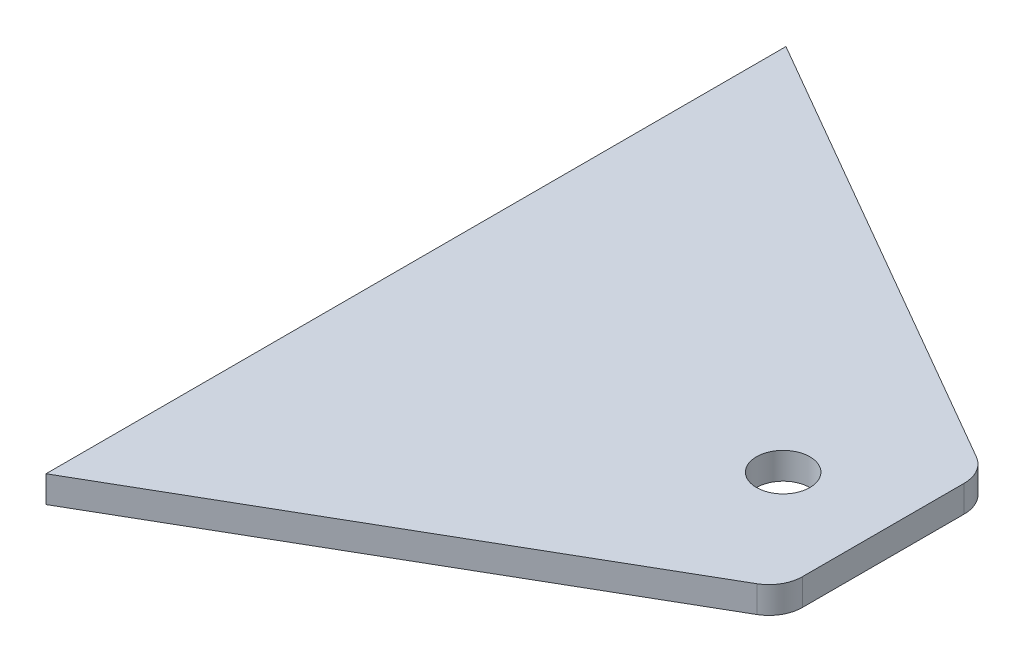
ISO-10303-21;
HEADER;
FILE_DESCRIPTION(('STEP AP214'),'2;1');
FILE_NAME('part.step','',(''),(''),'','','');
FILE_SCHEMA(('AUTOMOTIVE_DESIGN { 1 0 10303 214 1 1 1 1 }'));
ENDSEC;
DATA;
#1=APPLICATION_CONTEXT('core data for automotive mechanical design processes');
#2=APPLICATION_PROTOCOL_DEFINITION('international standard','automotive_design',2000,#1);
#3=PRODUCT_CONTEXT('',#1,'mechanical');
#4=PRODUCT('Part','Part','',(#3));
#5=PRODUCT_RELATED_PRODUCT_CATEGORY('part','',(#4));
#6=PRODUCT_DEFINITION_FORMATION('','',#4);
#7=PRODUCT_DEFINITION_CONTEXT('part definition',#1,'design');
#8=PRODUCT_DEFINITION('design','',#6,#7);
#9=PRODUCT_DEFINITION_SHAPE('','',#8);
#10=(LENGTH_UNIT() NAMED_UNIT(*) SI_UNIT(.MILLI.,.METRE.));
#11=(NAMED_UNIT(*) PLANE_ANGLE_UNIT() SI_UNIT($,.RADIAN.));
#12=(NAMED_UNIT(*) SI_UNIT($,.STERADIAN.) SOLID_ANGLE_UNIT());
#13=UNCERTAINTY_MEASURE_WITH_UNIT(LENGTH_MEASURE(1.E-05),#10,'distance_accuracy_value','');
#14=(GEOMETRIC_REPRESENTATION_CONTEXT(3) GLOBAL_UNCERTAINTY_ASSIGNED_CONTEXT((#13)) GLOBAL_UNIT_ASSIGNED_CONTEXT((#10,
#11,#12)) REPRESENTATION_CONTEXT('',''));
#15=CARTESIAN_POINT('',(0.,0.,0.));
#16=DIRECTION('',(0.,0.,1.));
#17=DIRECTION('',(1.,0.,0.));
#18=AXIS2_PLACEMENT_3D('',#15,#16,#17);
#19=CARTESIAN_POINT('',(69.9999999999992,4.,37.7259944682755));
#20=DIRECTION('',(-0.500000000000004,0.,-0.866025403784436));
#21=DIRECTION('',(-0.866025403784436,0.,0.500000000000004));
#22=AXIS2_PLACEMENT_3D('',#19,#20,#21);
#23=PLANE('',#22);
#24=DIRECTION('',(0.866025403784436,0.,-0.500000000000004));
#25=VECTOR('',#24,1.);
#26=CARTESIAN_POINT('',(69.9999999999992,0.,37.7259944682755));
#27=LINE('',#26,#25);
#28=CARTESIAN_POINT('',(-7.7889084071358E-13,0.,78.1405133115498));
#29=VERTEX_POINT('',#28);
#30=CARTESIAN_POINT('',(67.4999999999993,0.,39.1693701412496));
#31=VERTEX_POINT('',#30);
#32=EDGE_CURVE('E114',#29,#31,#27,.T.);
#33=ORIENTED_EDGE('',*,*,#32,.T.);
#34=DIRECTION('',(0.,-1.,0.));
#35=VECTOR('',#34,1.);
#36=CARTESIAN_POINT('',(67.4999999999993,4.,39.1693701412496));
#37=LINE('',#36,#35);
#38=CARTESIAN_POINT('',(67.4999999999993,4.,39.1693701412496));
#39=VERTEX_POINT('',#38);
#40=EDGE_CURVE('E58',#31,#39,#37,.F.);
#41=ORIENTED_EDGE('',*,*,#40,.T.);
#42=DIRECTION('',(0.866025403784436,0.,-0.500000000000004));
#43=VECTOR('',#42,1.);
#44=CARTESIAN_POINT('',(69.9999999999992,4.,37.7259944682755));
#45=LINE('',#44,#43);
#46=CARTESIAN_POINT('',(-7.7889084071358E-13,4.,78.1405133115498));
#47=VERTEX_POINT('',#46);
#48=EDGE_CURVE('E122',#47,#39,#45,.T.);
#49=ORIENTED_EDGE('',*,*,#48,.F.);
#50=DIRECTION('',(0.,-1.,0.));
#51=VECTOR('',#50,1.);
#52=CARTESIAN_POINT('',(-7.7889084071358E-13,4.,78.1405133115498));
#53=LINE('',#52,#51);
#54=EDGE_CURVE('E106',#47,#29,#53,.T.);
#55=ORIENTED_EDGE('',*,*,#54,.T.);
#56=EDGE_LOOP('',(#33,#41,#49,#55));
#57=FACE_BOUND('',#56,.T.);
#58=ADVANCED_FACE('F35',(#57),#23,.F.);
#59=CARTESIAN_POINT('',(69.9999999999992,4.,37.7259944682755));
#60=DIRECTION('',(-1.,0.,0.));
#61=DIRECTION('',(0.,0.,1.));
#62=AXIS2_PLACEMENT_3D('',#59,#60,#61);
#63=PLANE('',#62);
#64=DIRECTION('',(0.,0.,-1.));
#65=VECTOR('',#64,1.);
#66=CARTESIAN_POINT('',(69.9999999999992,4.,37.7259944682755));
#67=LINE('',#66,#65);
#68=CARTESIAN_POINT('',(69.9999999999992,4.,34.8392431223274));
#69=VERTEX_POINT('',#68);
#70=CARTESIAN_POINT('',(69.9999999999994,4.,10.612745814224));
#71=VERTEX_POINT('',#70);
#72=EDGE_CURVE('E96',#69,#71,#67,.T.);
#73=ORIENTED_EDGE('',*,*,#72,.F.);
#74=DIRECTION('',(0.,-1.,0.));
#75=VECTOR('',#74,1.);
#76=CARTESIAN_POINT('',(69.9999999999992,4.,34.8392431223274));
#77=LINE('',#76,#75);
#78=CARTESIAN_POINT('',(69.9999999999992,0.,34.8392431223274));
#79=VERTEX_POINT('',#78);
#80=EDGE_CURVE('E125',#69,#79,#77,.T.);
#81=ORIENTED_EDGE('',*,*,#80,.T.);
#82=DIRECTION('',(0.,0.,-1.));
#83=VECTOR('',#82,1.);
#84=CARTESIAN_POINT('',(69.9999999999992,0.,37.7259944682755));
#85=LINE('',#84,#83);
#86=CARTESIAN_POINT('',(69.9999999999994,0.,10.612745814224));
#87=VERTEX_POINT('',#86);
#88=EDGE_CURVE('E116',#79,#87,#85,.T.);
#89=ORIENTED_EDGE('',*,*,#88,.T.);
#90=DIRECTION('',(0.,-1.,0.));
#91=VECTOR('',#90,1.);
#92=CARTESIAN_POINT('',(69.9999999999994,4.,10.612745814224));
#93=LINE('',#92,#91);
#94=EDGE_CURVE('E105',#87,#71,#93,.F.);
#95=ORIENTED_EDGE('',*,*,#94,.T.);
#96=EDGE_LOOP('',(#73,#81,#89,#95));
#97=FACE_BOUND('',#96,.T.);
#98=ADVANCED_FACE('F138',(#97),#63,.F.);
#99=CARTESIAN_POINT('',(-7.7889084071358E-13,4.,-32.6885243749987));
#100=DIRECTION('',(-0.500000000000006,0.,0.866025403784435));
#101=DIRECTION('',(0.866025403784435,0.,0.500000000000006));
#102=AXIS2_PLACEMENT_3D('',#99,#100,#101);
#103=PLANE('',#102);
#104=DIRECTION('',(-0.866025403784435,0.,-0.500000000000006));
#105=VECTOR('',#104,1.);
#106=CARTESIAN_POINT('',(-7.7889084071358E-13,4.,-32.6885243749987));
#107=LINE('',#106,#105);
#108=CARTESIAN_POINT('',(67.4999999999994,4.,6.28261879530178));
#109=VERTEX_POINT('',#108);
#110=CARTESIAN_POINT('',(-7.7889084071358E-13,4.,-32.6885243749987));
#111=VERTEX_POINT('',#110);
#112=EDGE_CURVE('E88',#109,#111,#107,.T.);
#113=ORIENTED_EDGE('',*,*,#112,.F.);
#114=DIRECTION('',(0.,-1.,0.));
#115=VECTOR('',#114,1.);
#116=CARTESIAN_POINT('',(67.4999999999994,4.,6.28261879530177));
#117=LINE('',#116,#115);
#118=CARTESIAN_POINT('',(67.4999999999994,0.,6.28261879530178));
#119=VERTEX_POINT('',#118);
#120=EDGE_CURVE('E11',#109,#119,#117,.T.);
#121=ORIENTED_EDGE('',*,*,#120,.T.);
#122=DIRECTION('',(-0.866025403784435,0.,-0.500000000000006));
#123=VECTOR('',#122,1.);
#124=CARTESIAN_POINT('',(-7.7889084071358E-13,0.,-32.6885243749987));
#125=LINE('',#124,#123);
#126=CARTESIAN_POINT('',(-7.7889084071358E-13,0.,-32.6885243749987));
#127=VERTEX_POINT('',#126);
#128=EDGE_CURVE('E102',#119,#127,#125,.T.);
#129=ORIENTED_EDGE('',*,*,#128,.T.);
#130=DIRECTION('',(0.,-1.,0.));
#131=VECTOR('',#130,1.);
#132=CARTESIAN_POINT('',(-7.7889084071358E-13,4.,-32.6885243749987));
#133=LINE('',#132,#131);
#134=EDGE_CURVE('E99',#111,#127,#133,.T.);
#135=ORIENTED_EDGE('',*,*,#134,.F.);
#136=EDGE_LOOP('',(#113,#121,#129,#135));
#137=FACE_BOUND('',#136,.T.);
#138=ADVANCED_FACE('F100',(#137),#103,.F.);
#139=CARTESIAN_POINT('',(-7.7889084071358E-13,4.,78.1405133115498));
#140=DIRECTION('',(1.,0.,0.));
#141=DIRECTION('',(0.,0.,-1.));
#142=AXIS2_PLACEMENT_3D('',#139,#140,#141);
#143=PLANE('',#142);
#144=DIRECTION('',(0.,0.,1.));
#145=VECTOR('',#144,1.);
#146=CARTESIAN_POINT('',(-7.7889084071358E-13,0.,78.1405133115498));
#147=LINE('',#146,#145);
#148=EDGE_CURVE('E121',#127,#29,#147,.T.);
#149=ORIENTED_EDGE('',*,*,#148,.T.);
#150=ORIENTED_EDGE('',*,*,#54,.F.);
#151=DIRECTION('',(0.,0.,1.));
#152=VECTOR('',#151,1.);
#153=CARTESIAN_POINT('',(-7.7889084071358E-13,4.,78.1405133115498));
#154=LINE('',#153,#152);
#155=EDGE_CURVE('E92',#111,#47,#154,.T.);
#156=ORIENTED_EDGE('',*,*,#155,.F.);
#157=ORIENTED_EDGE('',*,*,#134,.T.);
#158=EDGE_LOOP('',(#149,#150,#156,#157));
#159=FACE_BOUND('',#158,.T.);
#160=ADVANCED_FACE('F108',(#159),#143,.F.);
#161=CARTESIAN_POINT('',(0.,4.,0.));
#162=DIRECTION('',(0.,-1.,0.));
#163=DIRECTION('',(0.,0.,-1.));
#164=AXIS2_PLACEMENT_3D('',#161,#162,#163);
#165=PLANE('',#164);
#166=CARTESIAN_POINT('',(54.9999999999992,4.,22.7259944682759));
#167=DIRECTION('',(0.,1.,0.));
#168=DIRECTION('',(0.,0.,1.));
#169=AXIS2_PLACEMENT_3D('',#166,#167,#168);
#170=CIRCLE('',#169,4.00000000000001);
#171=CARTESIAN_POINT('',(54.9999999999992,4.,26.7259944682759));
#172=VERTEX_POINT('',#171);
#173=EDGE_CURVE('E147',#172,#172,#170,.T.);
#174=ORIENTED_EDGE('',*,*,#173,.F.);
#175=EDGE_LOOP('',(#174));
#176=FACE_BOUND('',#175,.T.);
#177=ORIENTED_EDGE('',*,*,#48,.T.);
#178=CARTESIAN_POINT('',(64.9999999999992,4.,34.8392431223274));
#179=DIRECTION('',(0.,-1.,0.));
#180=DIRECTION('',(0.,0.,-1.));
#181=AXIS2_PLACEMENT_3D('',#178,#179,#180);
#182=CIRCLE('',#181,5.);
#183=EDGE_CURVE('E43',#39,#69,#182,.F.);
#184=ORIENTED_EDGE('',*,*,#183,.T.);
#185=ORIENTED_EDGE('',*,*,#72,.T.);
#186=CARTESIAN_POINT('',(64.9999999999994,4.,10.6127458142239));
#187=DIRECTION('',(0.,-1.,0.));
#188=DIRECTION('',(0.,0.,-1.));
#189=AXIS2_PLACEMENT_3D('',#186,#187,#188);
#190=CIRCLE('',#189,5.);
#191=EDGE_CURVE('E50',#71,#109,#190,.F.);
#192=ORIENTED_EDGE('',*,*,#191,.T.);
#193=ORIENTED_EDGE('',*,*,#112,.T.);
#194=ORIENTED_EDGE('',*,*,#155,.T.);
#195=EDGE_LOOP('',(#177,#184,#185,#192,#193,#194));
#196=FACE_BOUND('',#195,.T.);
#197=ADVANCED_FACE('F90',(#176,#196),#165,.F.);
#198=CARTESIAN_POINT('',(0.,0.,0.));
#199=DIRECTION('',(0.,-1.,0.));
#200=DIRECTION('',(0.,0.,-1.));
#201=AXIS2_PLACEMENT_3D('',#198,#199,#200);
#202=PLANE('',#201);
#203=CARTESIAN_POINT('',(54.9999999999992,0.,22.7259944682759));
#204=DIRECTION('',(0.,1.,0.));
#205=DIRECTION('',(0.,0.,1.));
#206=AXIS2_PLACEMENT_3D('',#203,#204,#205);
#207=CIRCLE('',#206,4.00000000000001);
#208=CARTESIAN_POINT('',(54.9999999999992,0.,26.7259944682759));
#209=VERTEX_POINT('',#208);
#210=EDGE_CURVE('E117',#209,#209,#207,.T.);
#211=ORIENTED_EDGE('',*,*,#210,.T.);
#212=EDGE_LOOP('',(#211));
#213=FACE_BOUND('',#212,.T.);
#214=ORIENTED_EDGE('',*,*,#88,.F.);
#215=CARTESIAN_POINT('',(64.9999999999992,0.,34.8392431223274));
#216=DIRECTION('',(0.,-1.,0.));
#217=DIRECTION('',(0.,0.,-1.));
#218=AXIS2_PLACEMENT_3D('',#215,#216,#217);
#219=CIRCLE('',#218,5.);
#220=EDGE_CURVE('E130',#79,#31,#219,.T.);
#221=ORIENTED_EDGE('',*,*,#220,.T.);
#222=ORIENTED_EDGE('',*,*,#32,.F.);
#223=ORIENTED_EDGE('',*,*,#148,.F.);
#224=ORIENTED_EDGE('',*,*,#128,.F.);
#225=CARTESIAN_POINT('',(64.9999999999994,0.,10.6127458142239));
#226=DIRECTION('',(0.,-1.,0.));
#227=DIRECTION('',(0.,0.,-1.));
#228=AXIS2_PLACEMENT_3D('',#225,#226,#227);
#229=CIRCLE('',#228,5.);
#230=EDGE_CURVE('E128',#119,#87,#229,.T.);
#231=ORIENTED_EDGE('',*,*,#230,.T.);
#232=EDGE_LOOP('',(#214,#221,#222,#223,#224,#231));
#233=FACE_BOUND('',#232,.T.);
#234=ADVANCED_FACE('F144',(#213,#233),#202,.T.);
#235=CARTESIAN_POINT('',(54.9999999999992,0.,22.7259944682759));
#236=DIRECTION('',(0.,1.,0.));
#237=DIRECTION('',(0.,0.,1.));
#238=AXIS2_PLACEMENT_3D('',#235,#236,#237);
#239=CYLINDRICAL_SURFACE('',#238,4.00000000000001);
#240=ORIENTED_EDGE('',*,*,#210,.F.);
#241=EDGE_LOOP('',(#240));
#242=FACE_BOUND('',#241,.T.);
#243=ORIENTED_EDGE('',*,*,#173,.T.);
#244=EDGE_LOOP('',(#243));
#245=FACE_BOUND('',#244,.T.);
#246=ADVANCED_FACE('F154',(#242,#245),#239,.F.);
#247=CARTESIAN_POINT('',(64.9999999999992,4.,34.8392431223274));
#248=DIRECTION('',(0.,-1.,0.));
#249=DIRECTION('',(0.,0.,-1.));
#250=AXIS2_PLACEMENT_3D('',#247,#248,#249);
#251=CYLINDRICAL_SURFACE('',#250,5.);
#252=ORIENTED_EDGE('',*,*,#183,.F.);
#253=ORIENTED_EDGE('',*,*,#40,.F.);
#254=ORIENTED_EDGE('',*,*,#220,.F.);
#255=ORIENTED_EDGE('',*,*,#80,.F.);
#256=EDGE_LOOP('',(#252,#253,#254,#255));
#257=FACE_BOUND('',#256,.T.);
#258=ADVANCED_FACE('F141',(#257),#251,.T.);
#259=CARTESIAN_POINT('',(64.9999999999994,4.,10.6127458142239));
#260=DIRECTION('',(0.,-1.,0.));
#261=DIRECTION('',(0.,0.,-1.));
#262=AXIS2_PLACEMENT_3D('',#259,#260,#261);
#263=CYLINDRICAL_SURFACE('',#262,5.);
#264=ORIENTED_EDGE('',*,*,#191,.F.);
#265=ORIENTED_EDGE('',*,*,#94,.F.);
#266=ORIENTED_EDGE('',*,*,#230,.F.);
#267=ORIENTED_EDGE('',*,*,#120,.F.);
#268=EDGE_LOOP('',(#264,#265,#266,#267));
#269=FACE_BOUND('',#268,.T.);
#270=ADVANCED_FACE('F37',(#269),#263,.T.);
#271=CLOSED_SHELL('',(#58,#98,#138,#160,#197,#234,#246,#258,#270));
#272=MANIFOLD_SOLID_BREP('B2',#271);
#273=ADVANCED_BREP_SHAPE_REPRESENTATION('',(#18,#272),#14);
#274=SHAPE_DEFINITION_REPRESENTATION(#9,#273);
ENDSEC;
END-ISO-10303-21;
